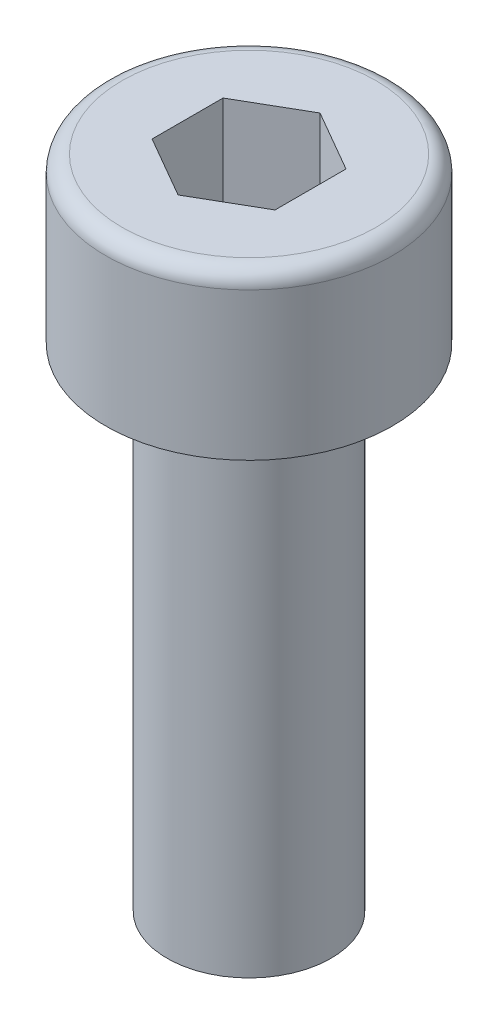
ISO-10303-21;
HEADER;
FILE_DESCRIPTION(('STEP AP214'),'2;1');
FILE_NAME('part.step','',(''),(''),'','','');
FILE_SCHEMA(('AUTOMOTIVE_DESIGN { 1 0 10303 214 1 1 1 1 }'));
ENDSEC;
DATA;
#1=APPLICATION_CONTEXT('core data for automotive mechanical design processes');
#2=APPLICATION_PROTOCOL_DEFINITION('international standard','automotive_design',2000,#1);
#3=PRODUCT_CONTEXT('',#1,'mechanical');
#4=PRODUCT('Part','Part','',(#3));
#5=PRODUCT_RELATED_PRODUCT_CATEGORY('part','',(#4));
#6=PRODUCT_DEFINITION_FORMATION('','',#4);
#7=PRODUCT_DEFINITION_CONTEXT('part definition',#1,'design');
#8=PRODUCT_DEFINITION('design','',#6,#7);
#9=PRODUCT_DEFINITION_SHAPE('','',#8);
#10=(LENGTH_UNIT() NAMED_UNIT(*) SI_UNIT(.MILLI.,.METRE.));
#11=(NAMED_UNIT(*) PLANE_ANGLE_UNIT() SI_UNIT($,.RADIAN.));
#12=(NAMED_UNIT(*) SI_UNIT($,.STERADIAN.) SOLID_ANGLE_UNIT());
#13=UNCERTAINTY_MEASURE_WITH_UNIT(LENGTH_MEASURE(1.E-05),#10,'distance_accuracy_value','');
#14=(GEOMETRIC_REPRESENTATION_CONTEXT(3) GLOBAL_UNCERTAINTY_ASSIGNED_CONTEXT((#13)) GLOBAL_UNIT_ASSIGNED_CONTEXT((#10,
#11,#12)) REPRESENTATION_CONTEXT('',''));
#15=CARTESIAN_POINT('',(0.,0.,0.));
#16=DIRECTION('',(0.,0.,1.));
#17=DIRECTION('',(1.,0.,0.));
#18=AXIS2_PLACEMENT_3D('',#15,#16,#17);
#19=CARTESIAN_POINT('',(0.,16.,0.));
#20=DIRECTION('',(0.,-1.,0.));
#21=DIRECTION('',(0.,0.,-1.));
#22=AXIS2_PLACEMENT_3D('',#19,#20,#21);
#23=PLANE('',#22);
#24=DIRECTION('',(-0.866025403784439,0.,0.5));
#25=VECTOR('',#24,1.);
#26=CARTESIAN_POINT('',(0.,16.,-1.73205080756888));
#27=LINE('',#26,#25);
#28=CARTESIAN_POINT('',(0.,16.,-1.73205080756888));
#29=VERTEX_POINT('',#28);
#30=CARTESIAN_POINT('',(-1.5,16.,-0.866025403784439));
#31=VERTEX_POINT('',#30);
#32=EDGE_CURVE('E125',#29,#31,#27,.T.);
#33=ORIENTED_EDGE('',*,*,#32,.F.);
#34=DIRECTION('',(-0.866025403784439,0.,-0.5));
#35=VECTOR('',#34,1.);
#36=CARTESIAN_POINT('',(1.5,16.,-0.866025403784439));
#37=LINE('',#36,#35);
#38=CARTESIAN_POINT('',(1.5,16.,-0.866025403784439));
#39=VERTEX_POINT('',#38);
#40=EDGE_CURVE('E51',#39,#29,#37,.T.);
#41=ORIENTED_EDGE('',*,*,#40,.F.);
#42=DIRECTION('',(0.,0.,-1.));
#43=VECTOR('',#42,1.);
#44=CARTESIAN_POINT('',(1.5,16.,0.86602540378444));
#45=LINE('',#44,#43);
#46=CARTESIAN_POINT('',(1.5,16.,0.86602540378444));
#47=VERTEX_POINT('',#46);
#48=EDGE_CURVE('E134',#47,#39,#45,.T.);
#49=ORIENTED_EDGE('',*,*,#48,.F.);
#50=DIRECTION('',(0.866025403784439,0.,-0.5));
#51=VECTOR('',#50,1.);
#52=CARTESIAN_POINT('',(0.,16.,1.73205080756888));
#53=LINE('',#52,#51);
#54=CARTESIAN_POINT('',(0.,16.,1.73205080756888));
#55=VERTEX_POINT('',#54);
#56=EDGE_CURVE('E132',#55,#47,#53,.T.);
#57=ORIENTED_EDGE('',*,*,#56,.F.);
#58=DIRECTION('',(0.866025403784438,0.,0.5));
#59=VECTOR('',#58,1.);
#60=CARTESIAN_POINT('',(-1.5,16.,0.866025403784439));
#61=LINE('',#60,#59);
#62=CARTESIAN_POINT('',(-1.5,16.,0.866025403784439));
#63=VERTEX_POINT('',#62);
#64=EDGE_CURVE('E99',#63,#55,#61,.T.);
#65=ORIENTED_EDGE('',*,*,#64,.F.);
#66=DIRECTION('',(0.,0.,1.));
#67=VECTOR('',#66,1.);
#68=CARTESIAN_POINT('',(-1.5,16.,-0.866025403784439));
#69=LINE('',#68,#67);
#70=EDGE_CURVE('E128',#31,#63,#69,.T.);
#71=ORIENTED_EDGE('',*,*,#70,.F.);
#72=EDGE_LOOP('',(#33,#41,#49,#57,#65,#71));
#73=FACE_BOUND('',#72,.T.);
#74=CARTESIAN_POINT('',(0.,16.,0.));
#75=DIRECTION('',(0.,-1.,0.));
#76=DIRECTION('',(0.,0.,-1.));
#77=AXIS2_PLACEMENT_3D('',#74,#75,#76);
#78=CIRCLE('',#77,3.1);
#79=CARTESIAN_POINT('',(0.,16.,-3.1));
#80=VERTEX_POINT('',#79);
#81=EDGE_CURVE('E11',#80,#80,#78,.T.);
#82=ORIENTED_EDGE('',*,*,#81,.F.);
#83=EDGE_LOOP('',(#82));
#84=FACE_BOUND('',#83,.T.);
#85=ADVANCED_FACE('F37',(#73,#84),#23,.F.);
#86=CARTESIAN_POINT('',(0.,15.6,0.));
#87=DIRECTION('',(0.,-1.,0.));
#88=DIRECTION('',(0.,0.,-1.));
#89=AXIS2_PLACEMENT_3D('',#86,#87,#88);
#90=TOROIDAL_SURFACE('',#89,3.1,0.4);
#91=CARTESIAN_POINT('',(0.,15.6,0.));
#92=DIRECTION('',(0.,-1.,0.));
#93=DIRECTION('',(0.,0.,-1.));
#94=AXIS2_PLACEMENT_3D('',#91,#92,#93);
#95=CIRCLE('',#94,3.5);
#96=CARTESIAN_POINT('',(0.,15.6,-3.5));
#97=VERTEX_POINT('',#96);
#98=EDGE_CURVE('E44',#97,#97,#95,.T.);
#99=ORIENTED_EDGE('',*,*,#98,.F.);
#100=EDGE_LOOP('',(#99));
#101=FACE_BOUND('',#100,.T.);
#102=ORIENTED_EDGE('',*,*,#81,.T.);
#103=EDGE_LOOP('',(#102));
#104=FACE_BOUND('',#103,.T.);
#105=ADVANCED_FACE('F156',(#101,#104),#90,.T.);
#106=CARTESIAN_POINT('',(0.,0.,0.));
#107=DIRECTION('',(0.,-1.,0.));
#108=DIRECTION('',(0.,0.,-1.));
#109=AXIS2_PLACEMENT_3D('',#106,#107,#108);
#110=CYLINDRICAL_SURFACE('',#109,3.5);
#111=CARTESIAN_POINT('',(0.,12.,0.));
#112=DIRECTION('',(0.,-1.,0.));
#113=DIRECTION('',(0.,0.,-1.));
#114=AXIS2_PLACEMENT_3D('',#111,#112,#113);
#115=CIRCLE('',#114,3.5);
#116=CARTESIAN_POINT('',(0.,12.,-3.5));
#117=VERTEX_POINT('',#116);
#118=EDGE_CURVE('E149',#117,#117,#115,.T.);
#119=ORIENTED_EDGE('',*,*,#118,.F.);
#120=EDGE_LOOP('',(#119));
#121=FACE_BOUND('',#120,.T.);
#122=ORIENTED_EDGE('',*,*,#98,.T.);
#123=EDGE_LOOP('',(#122));
#124=FACE_BOUND('',#123,.T.);
#125=ADVANCED_FACE('F154',(#121,#124),#110,.T.);
#126=CARTESIAN_POINT('',(-3.5,12.,0.));
#127=DIRECTION('',(0.,1.,0.));
#128=DIRECTION('',(0.,0.,1.));
#129=AXIS2_PLACEMENT_3D('',#126,#127,#128);
#130=PLANE('',#129);
#131=CARTESIAN_POINT('',(0.,12.,0.));
#132=DIRECTION('',(0.,-1.,0.));
#133=DIRECTION('',(0.,0.,-1.));
#134=AXIS2_PLACEMENT_3D('',#131,#132,#133);
#135=CIRCLE('',#134,2.);
#136=CARTESIAN_POINT('',(0.,12.,-2.));
#137=VERTEX_POINT('',#136);
#138=EDGE_CURVE('E146',#137,#137,#135,.T.);
#139=ORIENTED_EDGE('',*,*,#138,.F.);
#140=EDGE_LOOP('',(#139));
#141=FACE_BOUND('',#140,.T.);
#142=ORIENTED_EDGE('',*,*,#118,.T.);
#143=EDGE_LOOP('',(#142));
#144=FACE_BOUND('',#143,.T.);
#145=ADVANCED_FACE('F189',(#141,#144),#130,.F.);
#146=CARTESIAN_POINT('',(0.,0.,0.));
#147=DIRECTION('',(0.,-1.,0.));
#148=DIRECTION('',(0.,0.,-1.));
#149=AXIS2_PLACEMENT_3D('',#146,#147,#148);
#150=CYLINDRICAL_SURFACE('',#149,2.);
#151=CARTESIAN_POINT('',(0.,0.,0.));
#152=DIRECTION('',(0.,-1.,0.));
#153=DIRECTION('',(0.,0.,-1.));
#154=AXIS2_PLACEMENT_3D('',#151,#152,#153);
#155=CIRCLE('',#154,2.);
#156=CARTESIAN_POINT('',(0.,0.,-2.));
#157=VERTEX_POINT('',#156);
#158=EDGE_CURVE('E138',#157,#157,#155,.T.);
#159=ORIENTED_EDGE('',*,*,#158,.F.);
#160=EDGE_LOOP('',(#159));
#161=FACE_BOUND('',#160,.T.);
#162=ORIENTED_EDGE('',*,*,#138,.T.);
#163=EDGE_LOOP('',(#162));
#164=FACE_BOUND('',#163,.T.);
#165=ADVANCED_FACE('F181',(#161,#164),#150,.T.);
#166=CARTESIAN_POINT('',(-2.,0.,0.));
#167=DIRECTION('',(0.,1.,0.));
#168=DIRECTION('',(0.,0.,1.));
#169=AXIS2_PLACEMENT_3D('',#166,#167,#168);
#170=PLANE('',#169);
#171=ORIENTED_EDGE('',*,*,#158,.T.);
#172=EDGE_LOOP('',(#171));
#173=FACE_BOUND('',#172,.T.);
#174=ADVANCED_FACE('F175',(#173),#170,.F.);
#175=CARTESIAN_POINT('',(1.5,13.,-0.866025403784439));
#176=DIRECTION('',(0.5,0.,-0.866025403784439));
#177=DIRECTION('',(-0.866025403784439,0.,-0.5));
#178=AXIS2_PLACEMENT_3D('',#175,#176,#177);
#179=PLANE('',#178);
#180=ORIENTED_EDGE('',*,*,#40,.T.);
#181=DIRECTION('',(0.,1.,0.));
#182=VECTOR('',#181,1.);
#183=CARTESIAN_POINT('',(0.,13.,-1.73205080756888));
#184=LINE('',#183,#182);
#185=CARTESIAN_POINT('',(0.,13.,-1.73205080756888));
#186=VERTEX_POINT('',#185);
#187=EDGE_CURVE('E81',#186,#29,#184,.T.);
#188=ORIENTED_EDGE('',*,*,#187,.F.);
#189=DIRECTION('',(-0.866025403784439,0.,-0.5));
#190=VECTOR('',#189,1.);
#191=CARTESIAN_POINT('',(1.5,13.,-0.866025403784439));
#192=LINE('',#191,#190);
#193=CARTESIAN_POINT('',(1.5,13.,-0.866025403784439));
#194=VERTEX_POINT('',#193);
#195=EDGE_CURVE('E136',#194,#186,#192,.T.);
#196=ORIENTED_EDGE('',*,*,#195,.F.);
#197=DIRECTION('',(0.,1.,0.));
#198=VECTOR('',#197,1.);
#199=CARTESIAN_POINT('',(1.5,13.,-0.866025403784439));
#200=LINE('',#199,#198);
#201=EDGE_CURVE('E59',#194,#39,#200,.T.);
#202=ORIENTED_EDGE('',*,*,#201,.T.);
#203=EDGE_LOOP('',(#180,#188,#196,#202));
#204=FACE_BOUND('',#203,.T.);
#205=ADVANCED_FACE('F173',(#204),#179,.F.);
#206=CARTESIAN_POINT('',(1.5,13.,0.86602540378444));
#207=DIRECTION('',(1.,0.,0.));
#208=DIRECTION('',(0.,0.,-1.));
#209=AXIS2_PLACEMENT_3D('',#206,#207,#208);
#210=PLANE('',#209);
#211=ORIENTED_EDGE('',*,*,#48,.T.);
#212=ORIENTED_EDGE('',*,*,#201,.F.);
#213=DIRECTION('',(0.,0.,-1.));
#214=VECTOR('',#213,1.);
#215=CARTESIAN_POINT('',(1.5,13.,0.86602540378444));
#216=LINE('',#215,#214);
#217=CARTESIAN_POINT('',(1.5,13.,0.86602540378444));
#218=VERTEX_POINT('',#217);
#219=EDGE_CURVE('E111',#218,#194,#216,.T.);
#220=ORIENTED_EDGE('',*,*,#219,.F.);
#221=DIRECTION('',(0.,1.,0.));
#222=VECTOR('',#221,1.);
#223=CARTESIAN_POINT('',(1.5,13.,0.86602540378444));
#224=LINE('',#223,#222);
#225=EDGE_CURVE('E103',#218,#47,#224,.T.);
#226=ORIENTED_EDGE('',*,*,#225,.T.);
#227=EDGE_LOOP('',(#211,#212,#220,#226));
#228=FACE_BOUND('',#227,.T.);
#229=ADVANCED_FACE('F174',(#228),#210,.F.);
#230=CARTESIAN_POINT('',(0.,13.,1.73205080756888));
#231=DIRECTION('',(0.5,0.,0.866025403784439));
#232=DIRECTION('',(0.866025403784439,0.,-0.5));
#233=AXIS2_PLACEMENT_3D('',#230,#231,#232);
#234=PLANE('',#233);
#235=ORIENTED_EDGE('',*,*,#56,.T.);
#236=ORIENTED_EDGE('',*,*,#225,.F.);
#237=DIRECTION('',(0.866025403784439,0.,-0.5));
#238=VECTOR('',#237,1.);
#239=CARTESIAN_POINT('',(0.,13.,1.73205080756888));
#240=LINE('',#239,#238);
#241=CARTESIAN_POINT('',(0.,13.,1.73205080756888));
#242=VERTEX_POINT('',#241);
#243=EDGE_CURVE('E107',#242,#218,#240,.T.);
#244=ORIENTED_EDGE('',*,*,#243,.F.);
#245=DIRECTION('',(0.,1.,0.));
#246=VECTOR('',#245,1.);
#247=CARTESIAN_POINT('',(0.,13.,1.73205080756888));
#248=LINE('',#247,#246);
#249=EDGE_CURVE('E92',#242,#55,#248,.T.);
#250=ORIENTED_EDGE('',*,*,#249,.T.);
#251=EDGE_LOOP('',(#235,#236,#244,#250));
#252=FACE_BOUND('',#251,.T.);
#253=ADVANCED_FACE('F108',(#252),#234,.F.);
#254=CARTESIAN_POINT('',(-1.5,13.,0.866025403784439));
#255=DIRECTION('',(-0.5,0.,0.866025403784439));
#256=DIRECTION('',(0.866025403784439,0.,0.5));
#257=AXIS2_PLACEMENT_3D('',#254,#255,#256);
#258=PLANE('',#257);
#259=ORIENTED_EDGE('',*,*,#64,.T.);
#260=ORIENTED_EDGE('',*,*,#249,.F.);
#261=DIRECTION('',(0.866025403784438,0.,0.5));
#262=VECTOR('',#261,1.);
#263=CARTESIAN_POINT('',(-1.5,13.,0.866025403784439));
#264=LINE('',#263,#262);
#265=CARTESIAN_POINT('',(-1.5,13.,0.866025403784439));
#266=VERTEX_POINT('',#265);
#267=EDGE_CURVE('E96',#266,#242,#264,.T.);
#268=ORIENTED_EDGE('',*,*,#267,.F.);
#269=DIRECTION('',(0.,1.,0.));
#270=VECTOR('',#269,1.);
#271=CARTESIAN_POINT('',(-1.5,13.,0.866025403784439));
#272=LINE('',#271,#270);
#273=EDGE_CURVE('E104',#266,#63,#272,.T.);
#274=ORIENTED_EDGE('',*,*,#273,.T.);
#275=EDGE_LOOP('',(#259,#260,#268,#274));
#276=FACE_BOUND('',#275,.T.);
#277=ADVANCED_FACE('F94',(#276),#258,.F.);
#278=CARTESIAN_POINT('',(-1.5,13.,-0.866025403784439));
#279=DIRECTION('',(-1.,0.,0.));
#280=DIRECTION('',(0.,0.,1.));
#281=AXIS2_PLACEMENT_3D('',#278,#279,#280);
#282=PLANE('',#281);
#283=ORIENTED_EDGE('',*,*,#70,.T.);
#284=ORIENTED_EDGE('',*,*,#273,.F.);
#285=DIRECTION('',(0.,0.,1.));
#286=VECTOR('',#285,1.);
#287=CARTESIAN_POINT('',(-1.5,13.,-0.866025403784439));
#288=LINE('',#287,#286);
#289=CARTESIAN_POINT('',(-1.5,13.,-0.866025403784439));
#290=VERTEX_POINT('',#289);
#291=EDGE_CURVE('E117',#290,#266,#288,.T.);
#292=ORIENTED_EDGE('',*,*,#291,.F.);
#293=DIRECTION('',(0.,1.,0.));
#294=VECTOR('',#293,1.);
#295=CARTESIAN_POINT('',(-1.5,13.,-0.866025403784439));
#296=LINE('',#295,#294);
#297=EDGE_CURVE('E141',#290,#31,#296,.T.);
#298=ORIENTED_EDGE('',*,*,#297,.T.);
#299=EDGE_LOOP('',(#283,#284,#292,#298));
#300=FACE_BOUND('',#299,.T.);
#301=ADVANCED_FACE('F233',(#300),#282,.F.);
#302=CARTESIAN_POINT('',(0.,13.,-1.73205080756888));
#303=DIRECTION('',(-0.5,0.,-0.866025403784439));
#304=DIRECTION('',(-0.866025403784439,0.,0.5));
#305=AXIS2_PLACEMENT_3D('',#302,#303,#304);
#306=PLANE('',#305);
#307=ORIENTED_EDGE('',*,*,#32,.T.);
#308=ORIENTED_EDGE('',*,*,#297,.F.);
#309=DIRECTION('',(-0.866025403784439,0.,0.5));
#310=VECTOR('',#309,1.);
#311=CARTESIAN_POINT('',(0.,13.,-1.73205080756888));
#312=LINE('',#311,#310);
#313=EDGE_CURVE('E119',#186,#290,#312,.T.);
#314=ORIENTED_EDGE('',*,*,#313,.F.);
#315=ORIENTED_EDGE('',*,*,#187,.T.);
#316=EDGE_LOOP('',(#307,#308,#314,#315));
#317=FACE_BOUND('',#316,.T.);
#318=ADVANCED_FACE('F171',(#317),#306,.F.);
#319=CARTESIAN_POINT('',(0.,13.,0.));
#320=DIRECTION('',(0.,1.,0.));
#321=DIRECTION('',(0.,0.,1.));
#322=AXIS2_PLACEMENT_3D('',#319,#320,#321);
#323=PLANE('',#322);
#324=ORIENTED_EDGE('',*,*,#195,.T.);
#325=ORIENTED_EDGE('',*,*,#313,.T.);
#326=ORIENTED_EDGE('',*,*,#291,.T.);
#327=ORIENTED_EDGE('',*,*,#267,.T.);
#328=ORIENTED_EDGE('',*,*,#243,.T.);
#329=ORIENTED_EDGE('',*,*,#219,.T.);
#330=EDGE_LOOP('',(#324,#325,#326,#327,#328,#329));
#331=FACE_BOUND('',#330,.T.);
#332=ADVANCED_FACE('F114',(#331),#323,.T.);
#333=CLOSED_SHELL('',(#85,#105,#125,#145,#165,#174,#205,#229,#253,#277,#301,#318,#332));
#334=MANIFOLD_SOLID_BREP('B2',#333);
#335=ADVANCED_BREP_SHAPE_REPRESENTATION('',(#18,#334),#14);
#336=SHAPE_DEFINITION_REPRESENTATION(#9,#335);
ENDSEC;
END-ISO-10303-21;
